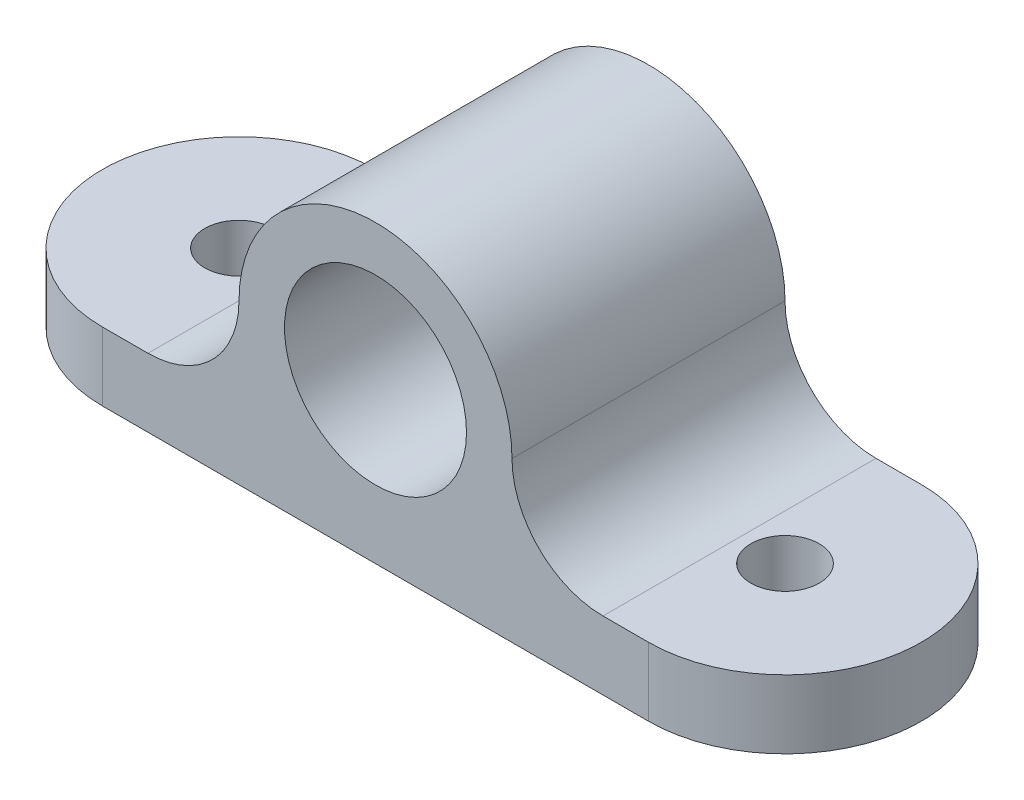
ISO-10303-21;
HEADER;
FILE_DESCRIPTION(('STEP AP214'),'2;1');
FILE_NAME('part.step','',(''),(''),'','','');
FILE_SCHEMA(('AUTOMOTIVE_DESIGN { 1 0 10303 214 1 1 1 1 }'));
ENDSEC;
DATA;
#1=APPLICATION_CONTEXT('core data for automotive mechanical design processes');
#2=APPLICATION_PROTOCOL_DEFINITION('international standard','automotive_design',2000,#1);
#3=PRODUCT_CONTEXT('',#1,'mechanical');
#4=PRODUCT('Part','Part','',(#3));
#5=PRODUCT_RELATED_PRODUCT_CATEGORY('part','',(#4));
#6=PRODUCT_DEFINITION_FORMATION('','',#4);
#7=PRODUCT_DEFINITION_CONTEXT('part definition',#1,'design');
#8=PRODUCT_DEFINITION('design','',#6,#7);
#9=PRODUCT_DEFINITION_SHAPE('','',#8);
#10=(LENGTH_UNIT() NAMED_UNIT(*) SI_UNIT(.MILLI.,.METRE.));
#11=(NAMED_UNIT(*) PLANE_ANGLE_UNIT() SI_UNIT($,.RADIAN.));
#12=(NAMED_UNIT(*) SI_UNIT($,.STERADIAN.) SOLID_ANGLE_UNIT());
#13=UNCERTAINTY_MEASURE_WITH_UNIT(LENGTH_MEASURE(1.E-05),#10,'distance_accuracy_value','');
#14=(GEOMETRIC_REPRESENTATION_CONTEXT(3) GLOBAL_UNCERTAINTY_ASSIGNED_CONTEXT((#13)) GLOBAL_UNIT_ASSIGNED_CONTEXT((#10,
#11,#12)) REPRESENTATION_CONTEXT('',''));
#15=CARTESIAN_POINT('',(0.,0.,0.));
#16=DIRECTION('',(0.,0.,1.));
#17=DIRECTION('',(1.,0.,0.));
#18=AXIS2_PLACEMENT_3D('',#15,#16,#17);
#19=CARTESIAN_POINT('',(0.,4.7752,0.));
#20=DIRECTION('',(0.,0.,-1.));
#21=DIRECTION('',(-1.,0.,0.));
#22=AXIS2_PLACEMENT_3D('',#19,#20,#21);
#23=PLANE('',#22);
#24=CARTESIAN_POINT('',(19.05,11.0998,0.));
#25=DIRECTION('',(0.,0.,1.));
#26=DIRECTION('',(1.,0.,0.));
#27=AXIS2_PLACEMENT_3D('',#24,#25,#26);
#28=CIRCLE('',#27,6.35);
#29=CARTESIAN_POINT('',(25.4,11.0998,0.));
#30=VERTEX_POINT('',#29);
#31=EDGE_CURVE('E192',#30,#30,#28,.T.);
#32=ORIENTED_EDGE('',*,*,#31,.F.);
#33=EDGE_LOOP('',(#32));
#34=FACE_BOUND('',#33,.T.);
#35=DIRECTION('',(1.,0.,0.));
#36=VECTOR('',#35,1.);
#37=CARTESIAN_POINT('',(0.,4.7752,0.));
#38=LINE('',#37,#36);
#39=CARTESIAN_POINT('',(34.924979679987,4.7752,0.));
#40=VERTEX_POINT('',#39);
#41=CARTESIAN_POINT('',(38.1,4.7752,0.));
#42=VERTEX_POINT('',#41);
#43=EDGE_CURVE('E147',#40,#42,#38,.T.);
#44=ORIENTED_EDGE('',*,*,#43,.F.);
#45=CARTESIAN_POINT('',(34.924979679987,11.1252,0.));
#46=DIRECTION('',(0.,0.,-1.));
#47=DIRECTION('',(-1.,0.,0.));
#48=AXIS2_PLACEMENT_3D('',#45,#46,#47);
#49=CIRCLE('',#48,6.35);
#50=CARTESIAN_POINT('',(28.5749878079922,11.11504,0.));
#51=VERTEX_POINT('',#50);
#52=EDGE_CURVE('E175',#40,#51,#49,.T.);
#53=ORIENTED_EDGE('',*,*,#52,.T.);
#54=CARTESIAN_POINT('',(19.05,11.0998,0.));
#55=DIRECTION('',(0.,0.,1.));
#56=DIRECTION('',(1.,0.,0.));
#57=AXIS2_PLACEMENT_3D('',#54,#55,#56);
#58=CIRCLE('',#57,9.525);
#59=CARTESIAN_POINT('',(9.5250121920078,11.11504,0.));
#60=VERTEX_POINT('',#59);
#61=EDGE_CURVE('E185',#51,#60,#58,.T.);
#62=ORIENTED_EDGE('',*,*,#61,.T.);
#63=CARTESIAN_POINT('',(3.17502032001301,11.1252,0.));
#64=DIRECTION('',(0.,0.,-1.));
#65=DIRECTION('',(-1.,0.,0.));
#66=AXIS2_PLACEMENT_3D('',#63,#64,#65);
#67=CIRCLE('',#66,6.35);
#68=CARTESIAN_POINT('',(3.17502032001301,4.7752,0.));
#69=VERTEX_POINT('',#68);
#70=EDGE_CURVE('E87',#60,#69,#67,.T.);
#71=ORIENTED_EDGE('',*,*,#70,.T.);
#72=CARTESIAN_POINT('',(0.,4.7752,0.));
#73=VERTEX_POINT('',#72);
#74=EDGE_CURVE('E140',#73,#69,#38,.T.);
#75=ORIENTED_EDGE('',*,*,#74,.F.);
#76=DIRECTION('',(0.,-1.,0.));
#77=VECTOR('',#76,1.);
#78=CARTESIAN_POINT('',(0.,4.7752,0.));
#79=LINE('',#78,#77);
#80=CARTESIAN_POINT('',(0.,0.,0.));
#81=VERTEX_POINT('',#80);
#82=EDGE_CURVE('E144',#73,#81,#79,.T.);
#83=ORIENTED_EDGE('',*,*,#82,.T.);
#84=DIRECTION('',(1.,0.,0.));
#85=VECTOR('',#84,1.);
#86=CARTESIAN_POINT('',(0.,0.,0.));
#87=LINE('',#86,#85);
#88=CARTESIAN_POINT('',(38.1,0.,0.));
#89=VERTEX_POINT('',#88);
#90=EDGE_CURVE('E218',#81,#89,#87,.T.);
#91=ORIENTED_EDGE('',*,*,#90,.T.);
#92=DIRECTION('',(0.,-1.,0.));
#93=VECTOR('',#92,1.);
#94=CARTESIAN_POINT('',(38.1,4.7752,0.));
#95=LINE('',#94,#93);
#96=EDGE_CURVE('E162',#42,#89,#95,.T.);
#97=ORIENTED_EDGE('',*,*,#96,.F.);
#98=EDGE_LOOP('',(#44,#53,#62,#71,#75,#83,#91,#97));
#99=FACE_BOUND('',#98,.T.);
#100=ADVANCED_FACE('F79',(#34,#99),#23,.F.);
#101=CARTESIAN_POINT('',(0.,4.7752,-19.05));
#102=DIRECTION('',(0.,0.,1.));
#103=DIRECTION('',(1.,0.,0.));
#104=AXIS2_PLACEMENT_3D('',#101,#102,#103);
#105=PLANE('',#104);
#106=CARTESIAN_POINT('',(19.05,11.0998,-19.05));
#107=DIRECTION('',(0.,0.,1.));
#108=DIRECTION('',(1.,0.,0.));
#109=AXIS2_PLACEMENT_3D('',#106,#107,#108);
#110=CIRCLE('',#109,6.35);
#111=CARTESIAN_POINT('',(25.4,11.0998,-19.05));
#112=VERTEX_POINT('',#111);
#113=EDGE_CURVE('E197',#112,#112,#110,.T.);
#114=ORIENTED_EDGE('',*,*,#113,.T.);
#115=EDGE_LOOP('',(#114));
#116=FACE_BOUND('',#115,.T.);
#117=CARTESIAN_POINT('',(19.05,11.0998,-19.05));
#118=DIRECTION('',(0.,0.,1.));
#119=DIRECTION('',(1.,0.,0.));
#120=AXIS2_PLACEMENT_3D('',#117,#118,#119);
#121=CIRCLE('',#120,9.525);
#122=CARTESIAN_POINT('',(28.5749878079922,11.11504,-19.05));
#123=VERTEX_POINT('',#122);
#124=CARTESIAN_POINT('',(9.5250121920078,11.11504,-19.05));
#125=VERTEX_POINT('',#124);
#126=EDGE_CURVE('E188',#123,#125,#121,.T.);
#127=ORIENTED_EDGE('',*,*,#126,.F.);
#128=CARTESIAN_POINT('',(34.924979679987,11.1252,-19.05));
#129=DIRECTION('',(0.,0.,1.));
#130=DIRECTION('',(1.,0.,0.));
#131=AXIS2_PLACEMENT_3D('',#128,#129,#130);
#132=CIRCLE('',#131,6.35);
#133=CARTESIAN_POINT('',(34.924979679987,4.7752,-19.05));
#134=VERTEX_POINT('',#133);
#135=EDGE_CURVE('E173',#123,#134,#132,.T.);
#136=ORIENTED_EDGE('',*,*,#135,.T.);
#137=DIRECTION('',(-1.,0.,0.));
#138=VECTOR('',#137,1.);
#139=CARTESIAN_POINT('',(0.,4.7752,-19.05));
#140=LINE('',#139,#138);
#141=CARTESIAN_POINT('',(38.1,4.7752,-19.05));
#142=VERTEX_POINT('',#141);
#143=EDGE_CURVE('E213',#142,#134,#140,.T.);
#144=ORIENTED_EDGE('',*,*,#143,.F.);
#145=DIRECTION('',(0.,-1.,0.));
#146=VECTOR('',#145,1.);
#147=CARTESIAN_POINT('',(38.1,4.7752,-19.05));
#148=LINE('',#147,#146);
#149=CARTESIAN_POINT('',(38.1,0.,-19.05));
#150=VERTEX_POINT('',#149);
#151=EDGE_CURVE('E168',#142,#150,#148,.T.);
#152=ORIENTED_EDGE('',*,*,#151,.T.);
#153=DIRECTION('',(-1.,0.,0.));
#154=VECTOR('',#153,1.);
#155=CARTESIAN_POINT('',(0.,0.,-19.05));
#156=LINE('',#155,#154);
#157=CARTESIAN_POINT('',(0.,0.,-19.05));
#158=VERTEX_POINT('',#157);
#159=EDGE_CURVE('E156',#150,#158,#156,.T.);
#160=ORIENTED_EDGE('',*,*,#159,.T.);
#161=DIRECTION('',(0.,-1.,0.));
#162=VECTOR('',#161,1.);
#163=CARTESIAN_POINT('',(0.,4.7752,-19.05));
#164=LINE('',#163,#162);
#165=CARTESIAN_POINT('',(0.,4.7752,-19.05));
#166=VERTEX_POINT('',#165);
#167=EDGE_CURVE('E216',#166,#158,#164,.T.);
#168=ORIENTED_EDGE('',*,*,#167,.F.);
#169=CARTESIAN_POINT('',(3.17502032001301,4.7752,-19.05));
#170=VERTEX_POINT('',#169);
#171=EDGE_CURVE('E152',#170,#166,#140,.T.);
#172=ORIENTED_EDGE('',*,*,#171,.F.);
#173=CARTESIAN_POINT('',(3.17502032001301,11.1252,-19.05));
#174=DIRECTION('',(0.,0.,1.));
#175=DIRECTION('',(1.,0.,0.));
#176=AXIS2_PLACEMENT_3D('',#173,#174,#175);
#177=CIRCLE('',#176,6.35);
#178=EDGE_CURVE('E12',#170,#125,#177,.T.);
#179=ORIENTED_EDGE('',*,*,#178,.T.);
#180=EDGE_LOOP('',(#127,#136,#144,#152,#160,#168,#172,#179));
#181=FACE_BOUND('',#180,.T.);
#182=ADVANCED_FACE('F228',(#116,#181),#105,.F.);
#183=CARTESIAN_POINT('',(0.,4.7752,-9.525));
#184=DIRECTION('',(0.,-1.,0.));
#185=DIRECTION('',(0.,0.,-1.));
#186=AXIS2_PLACEMENT_3D('',#183,#184,#185);
#187=PLANE('',#186);
#188=CARTESIAN_POINT('',(0.,4.7752,-9.525));
#189=DIRECTION('',(0.,1.,0.));
#190=DIRECTION('',(0.,0.,1.));
#191=AXIS2_PLACEMENT_3D('',#188,#189,#190);
#192=CIRCLE('',#191,2.3876);
#193=CARTESIAN_POINT('',(0.,4.7752,-7.1374));
#194=VERTEX_POINT('',#193);
#195=EDGE_CURVE('E194',#194,#194,#192,.T.);
#196=ORIENTED_EDGE('',*,*,#195,.F.);
#197=EDGE_LOOP('',(#196));
#198=FACE_BOUND('',#197,.T.);
#199=ORIENTED_EDGE('',*,*,#74,.T.);
#200=DIRECTION('',(0.,0.,1.));
#201=VECTOR('',#200,1.);
#202=CARTESIAN_POINT('',(3.17502032001301,4.7752,-9.525));
#203=LINE('',#202,#201);
#204=EDGE_CURVE('E100',#69,#170,#203,.F.);
#205=ORIENTED_EDGE('',*,*,#204,.T.);
#206=ORIENTED_EDGE('',*,*,#171,.T.);
#207=CARTESIAN_POINT('',(0.,4.7752,-9.525));
#208=DIRECTION('',(0.,1.,0.));
#209=DIRECTION('',(0.,0.,-1.));
#210=AXIS2_PLACEMENT_3D('',#207,#208,#209);
#211=CIRCLE('',#210,9.525);
#212=EDGE_CURVE('E150',#166,#73,#211,.T.);
#213=ORIENTED_EDGE('',*,*,#212,.T.);
#214=EDGE_LOOP('',(#199,#205,#206,#213));
#215=FACE_BOUND('',#214,.T.);
#216=ADVANCED_FACE('F151',(#198,#215),#187,.F.);
#217=CARTESIAN_POINT('',(38.1,4.7752,-9.525));
#218=DIRECTION('',(0.,1.,0.));
#219=DIRECTION('',(0.,0.,1.));
#220=AXIS2_PLACEMENT_3D('',#217,#218,#219);
#221=CIRCLE('',#220,2.3876);
#222=CARTESIAN_POINT('',(38.1,4.7752,-7.1374));
#223=VERTEX_POINT('',#222);
#224=EDGE_CURVE('E204',#223,#223,#221,.T.);
#225=ORIENTED_EDGE('',*,*,#224,.F.);
#226=EDGE_LOOP('',(#225));
#227=FACE_BOUND('',#226,.T.);
#228=ORIENTED_EDGE('',*,*,#143,.T.);
#229=DIRECTION('',(0.,0.,1.));
#230=VECTOR('',#229,1.);
#231=CARTESIAN_POINT('',(34.924979679987,4.7752,-9.525));
#232=LINE('',#231,#230);
#233=EDGE_CURVE('E165',#134,#40,#232,.T.);
#234=ORIENTED_EDGE('',*,*,#233,.T.);
#235=ORIENTED_EDGE('',*,*,#43,.T.);
#236=CARTESIAN_POINT('',(38.1,4.7752,-9.525));
#237=DIRECTION('',(0.,1.,0.));
#238=DIRECTION('',(0.,0.,1.));
#239=AXIS2_PLACEMENT_3D('',#236,#237,#238);
#240=CIRCLE('',#239,9.525);
#241=EDGE_CURVE('E146',#42,#142,#240,.T.);
#242=ORIENTED_EDGE('',*,*,#241,.T.);
#243=EDGE_LOOP('',(#228,#234,#235,#242));
#244=FACE_BOUND('',#243,.T.);
#245=ADVANCED_FACE('F237',(#227,#244),#187,.F.);
#246=CARTESIAN_POINT('',(0.,4.7752,-9.525));
#247=DIRECTION('',(0.,-1.,0.));
#248=DIRECTION('',(0.,0.,-1.));
#249=AXIS2_PLACEMENT_3D('',#246,#247,#248);
#250=CYLINDRICAL_SURFACE('',#249,9.525);
#251=CARTESIAN_POINT('',(0.,0.,-9.525));
#252=DIRECTION('',(0.,1.,0.));
#253=DIRECTION('',(0.,0.,-1.));
#254=AXIS2_PLACEMENT_3D('',#251,#252,#253);
#255=CIRCLE('',#254,9.525);
#256=EDGE_CURVE('E160',#158,#81,#255,.T.);
#257=ORIENTED_EDGE('',*,*,#256,.T.);
#258=ORIENTED_EDGE('',*,*,#82,.F.);
#259=ORIENTED_EDGE('',*,*,#212,.F.);
#260=ORIENTED_EDGE('',*,*,#167,.T.);
#261=EDGE_LOOP('',(#257,#258,#259,#260));
#262=FACE_BOUND('',#261,.T.);
#263=ADVANCED_FACE('F158',(#262),#250,.T.);
#264=CARTESIAN_POINT('',(38.1,4.7752,-9.525));
#265=DIRECTION('',(0.,-1.,0.));
#266=DIRECTION('',(0.,0.,-1.));
#267=AXIS2_PLACEMENT_3D('',#264,#265,#266);
#268=CYLINDRICAL_SURFACE('',#267,9.525);
#269=CARTESIAN_POINT('',(38.1,0.,-9.525));
#270=DIRECTION('',(0.,1.,0.));
#271=DIRECTION('',(0.,0.,1.));
#272=AXIS2_PLACEMENT_3D('',#269,#270,#271);
#273=CIRCLE('',#272,9.525);
#274=EDGE_CURVE('E220',#89,#150,#273,.T.);
#275=ORIENTED_EDGE('',*,*,#274,.T.);
#276=ORIENTED_EDGE('',*,*,#151,.F.);
#277=ORIENTED_EDGE('',*,*,#241,.F.);
#278=ORIENTED_EDGE('',*,*,#96,.T.);
#279=EDGE_LOOP('',(#275,#276,#277,#278));
#280=FACE_BOUND('',#279,.T.);
#281=ADVANCED_FACE('F235',(#280),#268,.T.);
#282=CARTESIAN_POINT('',(0.,0.,-9.525));
#283=DIRECTION('',(0.,-1.,0.));
#284=DIRECTION('',(0.,0.,-1.));
#285=AXIS2_PLACEMENT_3D('',#282,#283,#284);
#286=PLANE('',#285);
#287=CARTESIAN_POINT('',(38.1,0.,-9.525));
#288=DIRECTION('',(0.,1.,0.));
#289=DIRECTION('',(0.,0.,1.));
#290=AXIS2_PLACEMENT_3D('',#287,#288,#289);
#291=CIRCLE('',#290,2.3876);
#292=CARTESIAN_POINT('',(38.1,0.,-7.1374));
#293=VERTEX_POINT('',#292);
#294=EDGE_CURVE('E201',#293,#293,#291,.T.);
#295=ORIENTED_EDGE('',*,*,#294,.T.);
#296=EDGE_LOOP('',(#295));
#297=FACE_BOUND('',#296,.T.);
#298=CARTESIAN_POINT('',(0.,0.,-9.525));
#299=DIRECTION('',(0.,1.,0.));
#300=DIRECTION('',(0.,0.,1.));
#301=AXIS2_PLACEMENT_3D('',#298,#299,#300);
#302=CIRCLE('',#301,2.3876);
#303=CARTESIAN_POINT('',(0.,0.,-7.1374));
#304=VERTEX_POINT('',#303);
#305=EDGE_CURVE('E207',#304,#304,#302,.T.);
#306=ORIENTED_EDGE('',*,*,#305,.T.);
#307=EDGE_LOOP('',(#306));
#308=FACE_BOUND('',#307,.T.);
#309=ORIENTED_EDGE('',*,*,#256,.F.);
#310=ORIENTED_EDGE('',*,*,#159,.F.);
#311=ORIENTED_EDGE('',*,*,#274,.F.);
#312=ORIENTED_EDGE('',*,*,#90,.F.);
#313=EDGE_LOOP('',(#309,#310,#311,#312));
#314=FACE_BOUND('',#313,.T.);
#315=ADVANCED_FACE('F233',(#297,#308,#314),#286,.T.);
#316=CARTESIAN_POINT('',(0.,0.,-9.525));
#317=DIRECTION('',(0.,1.,0.));
#318=DIRECTION('',(0.,0.,1.));
#319=AXIS2_PLACEMENT_3D('',#316,#317,#318);
#320=CYLINDRICAL_SURFACE('',#319,2.3876);
#321=ORIENTED_EDGE('',*,*,#305,.F.);
#322=EDGE_LOOP('',(#321));
#323=FACE_BOUND('',#322,.T.);
#324=ORIENTED_EDGE('',*,*,#195,.T.);
#325=EDGE_LOOP('',(#324));
#326=FACE_BOUND('',#325,.T.);
#327=ADVANCED_FACE('F271',(#323,#326),#320,.F.);
#328=CARTESIAN_POINT('',(38.1,0.,-9.525));
#329=DIRECTION('',(0.,1.,0.));
#330=DIRECTION('',(0.,0.,1.));
#331=AXIS2_PLACEMENT_3D('',#328,#329,#330);
#332=CYLINDRICAL_SURFACE('',#331,2.3876);
#333=ORIENTED_EDGE('',*,*,#294,.F.);
#334=EDGE_LOOP('',(#333));
#335=FACE_BOUND('',#334,.T.);
#336=ORIENTED_EDGE('',*,*,#224,.T.);
#337=EDGE_LOOP('',(#336));
#338=FACE_BOUND('',#337,.T.);
#339=ADVANCED_FACE('F278',(#335,#338),#332,.F.);
#340=CARTESIAN_POINT('',(19.05,11.0998,-19.05));
#341=DIRECTION('',(0.,0.,1.));
#342=DIRECTION('',(1.,0.,0.));
#343=AXIS2_PLACEMENT_3D('',#340,#341,#342);
#344=CYLINDRICAL_SURFACE('',#343,9.525);
#345=ORIENTED_EDGE('',*,*,#126,.T.);
#346=DIRECTION('',(0.,0.,1.));
#347=VECTOR('',#346,1.);
#348=CARTESIAN_POINT('',(9.5250121920078,11.11504,-19.05));
#349=LINE('',#348,#347);
#350=EDGE_CURVE('E177',#125,#60,#349,.T.);
#351=ORIENTED_EDGE('',*,*,#350,.T.);
#352=ORIENTED_EDGE('',*,*,#61,.F.);
#353=DIRECTION('',(0.,0.,1.));
#354=VECTOR('',#353,1.);
#355=CARTESIAN_POINT('',(28.5749878079922,11.11504,-19.05));
#356=LINE('',#355,#354);
#357=EDGE_CURVE('E161',#51,#123,#356,.F.);
#358=ORIENTED_EDGE('',*,*,#357,.T.);
#359=EDGE_LOOP('',(#345,#351,#352,#358));
#360=FACE_BOUND('',#359,.T.);
#361=ADVANCED_FACE('F184',(#360),#344,.T.);
#362=CARTESIAN_POINT('',(19.05,11.0998,-19.05));
#363=DIRECTION('',(0.,0.,1.));
#364=DIRECTION('',(1.,0.,0.));
#365=AXIS2_PLACEMENT_3D('',#362,#363,#364);
#366=CYLINDRICAL_SURFACE('',#365,6.35);
#367=CARTESIAN_POINT('',(25.4,11.0998,-19.05));
#368=CARTESIAN_POINT('',(25.4,11.0998,-18.8515625));
#369=CARTESIAN_POINT('',(25.4,11.0998,-18.653125));
#370=CARTESIAN_POINT('',(25.4,11.0998,-18.25625));
#371=CARTESIAN_POINT('',(25.4,11.0998,-18.0578125));
#372=CARTESIAN_POINT('',(25.4,11.0998,-17.6609375));
#373=CARTESIAN_POINT('',(25.4,11.0998,-17.4625));
#374=CARTESIAN_POINT('',(25.4,11.0998,-17.065625));
#375=CARTESIAN_POINT('',(25.4,11.0998,-16.8671875));
#376=CARTESIAN_POINT('',(25.4,11.0998,-16.4703125));
#377=CARTESIAN_POINT('',(25.4,11.0998,-16.271875));
#378=CARTESIAN_POINT('',(25.4,11.0998,-15.875));
#379=CARTESIAN_POINT('',(25.4,11.0998,-15.6765625));
#380=CARTESIAN_POINT('',(25.4,11.0998,-15.2796875));
#381=CARTESIAN_POINT('',(25.4,11.0998,-15.08125));
#382=CARTESIAN_POINT('',(25.4,11.0998,-14.684375));
#383=CARTESIAN_POINT('',(25.4,11.0998,-14.4859375));
#384=CARTESIAN_POINT('',(25.4,11.0998,-14.0890625));
#385=CARTESIAN_POINT('',(25.4,11.0998,-13.890625));
#386=CARTESIAN_POINT('',(25.4,11.0998,-13.49375));
#387=CARTESIAN_POINT('',(25.4,11.0998,-13.2953125));
#388=CARTESIAN_POINT('',(25.4,11.0998,-12.8984375));
#389=CARTESIAN_POINT('',(25.4,11.0998,-12.7));
#390=CARTESIAN_POINT('',(25.4,11.0998,-12.303125));
#391=CARTESIAN_POINT('',(25.4,11.0998,-12.1046875));
#392=CARTESIAN_POINT('',(25.4,11.0998,-11.7078125));
#393=CARTESIAN_POINT('',(25.4,11.0998,-11.509375));
#394=CARTESIAN_POINT('',(25.4,11.0998,-11.1125));
#395=CARTESIAN_POINT('',(25.4,11.0998,-10.9140625));
#396=CARTESIAN_POINT('',(25.4,11.0998,-10.5171875));
#397=CARTESIAN_POINT('',(25.4,11.0998,-10.31875));
#398=CARTESIAN_POINT('',(25.4,11.0998,-9.921875));
#399=CARTESIAN_POINT('',(25.4,11.0998,-9.7234375));
#400=CARTESIAN_POINT('',(25.4,11.0998,-9.3265625));
#401=CARTESIAN_POINT('',(25.4,11.0998,-9.128125));
#402=CARTESIAN_POINT('',(25.4,11.0998,-8.73125));
#403=CARTESIAN_POINT('',(25.4,11.0998,-8.5328125));
#404=CARTESIAN_POINT('',(25.4,11.0998,-8.1359375));
#405=CARTESIAN_POINT('',(25.4,11.0998,-7.9375));
#406=CARTESIAN_POINT('',(25.4,11.0998,-7.540625));
#407=CARTESIAN_POINT('',(25.4,11.0998,-7.3421875));
#408=CARTESIAN_POINT('',(25.4,11.0998,-6.9453125));
#409=CARTESIAN_POINT('',(25.4,11.0998,-6.746875));
#410=CARTESIAN_POINT('',(25.4,11.0998,-6.35));
#411=CARTESIAN_POINT('',(25.4,11.0998,-6.1515625));
#412=CARTESIAN_POINT('',(25.4,11.0998,-5.7546875));
#413=CARTESIAN_POINT('',(25.4,11.0998,-5.55625));
#414=CARTESIAN_POINT('',(25.4,11.0998,-5.159375));
#415=CARTESIAN_POINT('',(25.4,11.0998,-4.9609375));
#416=CARTESIAN_POINT('',(25.4,11.0998,-4.5640625));
#417=CARTESIAN_POINT('',(25.4,11.0998,-4.365625));
#418=CARTESIAN_POINT('',(25.4,11.0998,-3.96875));
#419=CARTESIAN_POINT('',(25.4,11.0998,-3.7703125));
#420=CARTESIAN_POINT('',(25.4,11.0998,-3.3734375));
#421=CARTESIAN_POINT('',(25.4,11.0998,-3.175));
#422=CARTESIAN_POINT('',(25.4,11.0998,-2.778125));
#423=CARTESIAN_POINT('',(25.4,11.0998,-2.5796875));
#424=CARTESIAN_POINT('',(25.4,11.0998,-2.1828125));
#425=CARTESIAN_POINT('',(25.4,11.0998,-1.984375));
#426=CARTESIAN_POINT('',(25.4,11.0998,-1.5875));
#427=CARTESIAN_POINT('',(25.4,11.0998,-1.3890625));
#428=CARTESIAN_POINT('',(25.4,11.0998,-0.992187500000001));
#429=CARTESIAN_POINT('',(25.4,11.0998,-0.793750000000001));
#430=CARTESIAN_POINT('',(25.4,11.0998,-0.396875));
#431=CARTESIAN_POINT('',(25.4,11.0998,-0.1984375));
#432=CARTESIAN_POINT('',(25.4,11.0998,0.));
#433=B_SPLINE_CURVE_WITH_KNOTS('',3,(#367,#368,#369,#370,#371,#372,#373,#374,#375,#376,#377,
#378,#379,#380,#381,#382,#383,#384,#385,#386,#387,#388,#389,#390,#391,#392,#393,#394,#395,#396,
#397,#398,#399,#400,#401,#402,#403,#404,#405,#406,#407,#408,#409,#410,#411,#412,#413,#414,#415,
#416,#417,#418,#419,#420,#421,#422,#423,#424,#425,#426,#427,#428,#429,#430,#431,#432),
.UNSPECIFIED.,.F.,.F.,(4,2,2,2,2,2,2,2,2,2,2,2,2,2,2,2,2,2,2,2,2,2,2,2,2,2,2,2,2,2,2,2,4),(0.,
0.595312499999997,1.190625,1.7859375,2.38125,2.9765625,3.571875,4.1671875,4.7625,5.3578125,
5.953125,6.5484375,7.14375,7.7390625,8.334375,8.9296875,9.525,10.1203125,10.715625,11.3109375,
11.90625,12.5015625,13.096875,13.6921875,14.2875,14.8828125,15.478125,16.0734375,16.66875,
17.2640625,17.859375,18.4546875,19.05),.UNSPECIFIED.);
#434=EDGE_CURVE('BSEAM245',#112,#30,#433,.T.);
#435=ORIENTED_EDGE('',*,*,#113,.F.);
#436=ORIENTED_EDGE('',*,*,#31,.T.);
#437=ORIENTED_EDGE('',*,*,#434,.T.);
#438=ORIENTED_EDGE('',*,*,#434,.F.);
#439=EDGE_LOOP('',(#435,#437,#436,#438));
#440=FACE_BOUND('',#439,.T.);
#441=ADVANCED_FACE('F245',(#440),#366,.F.);
#442=CARTESIAN_POINT('',(34.924979679987,11.1252,-19.05));
#443=DIRECTION('',(0.,0.,1.));
#444=DIRECTION('',(1.,0.,0.));
#445=AXIS2_PLACEMENT_3D('',#442,#443,#444);
#446=CYLINDRICAL_SURFACE('',#445,6.35);
#447=ORIENTED_EDGE('',*,*,#52,.F.);
#448=ORIENTED_EDGE('',*,*,#233,.F.);
#449=ORIENTED_EDGE('',*,*,#135,.F.);
#450=ORIENTED_EDGE('',*,*,#357,.F.);
#451=EDGE_LOOP('',(#447,#448,#449,#450));
#452=FACE_BOUND('',#451,.T.);
#453=ADVANCED_FACE('F240',(#452),#446,.F.);
#454=CARTESIAN_POINT('',(3.17502032001301,11.1252,-19.05));
#455=DIRECTION('',(0.,0.,1.));
#456=DIRECTION('',(1.,0.,0.));
#457=AXIS2_PLACEMENT_3D('',#454,#455,#456);
#458=CYLINDRICAL_SURFACE('',#457,6.35);
#459=ORIENTED_EDGE('',*,*,#178,.F.);
#460=ORIENTED_EDGE('',*,*,#204,.F.);
#461=ORIENTED_EDGE('',*,*,#70,.F.);
#462=ORIENTED_EDGE('',*,*,#350,.F.);
#463=EDGE_LOOP('',(#459,#460,#461,#462));
#464=FACE_BOUND('',#463,.T.);
#465=ADVANCED_FACE('F81',(#464),#458,.F.);
#466=CLOSED_SHELL('',(#100,#182,#216,#245,#263,#281,#315,#327,#339,#361,#441,#453,#465));
#467=MANIFOLD_SOLID_BREP('B2',#466);
#468=ADVANCED_BREP_SHAPE_REPRESENTATION('',(#18,#467),#14);
#469=SHAPE_DEFINITION_REPRESENTATION(#9,#468);
ENDSEC;
END-ISO-10303-21;
